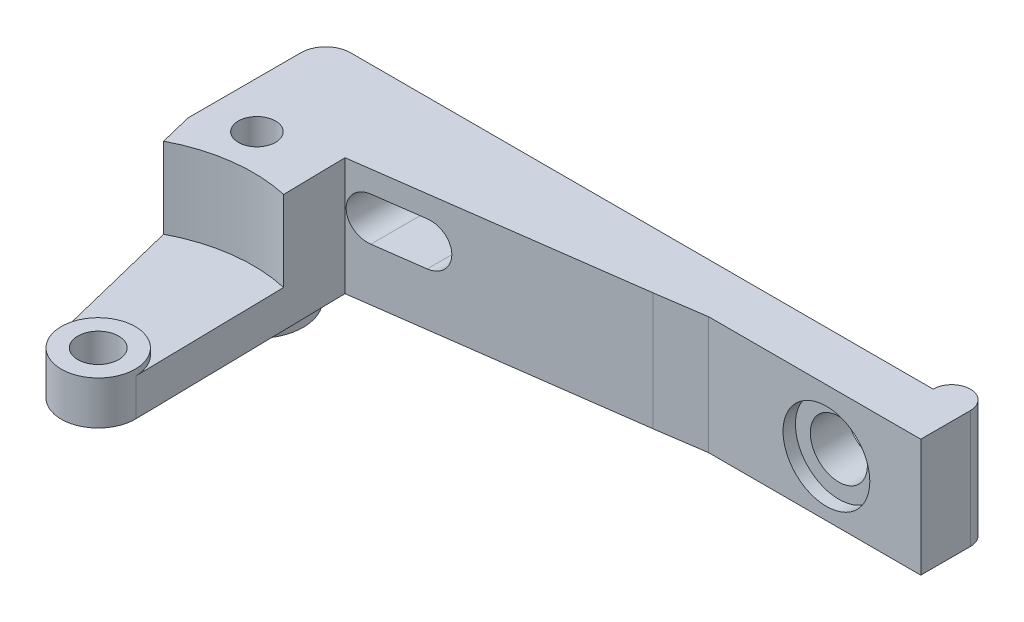
ISO-10303-21;
HEADER;
FILE_DESCRIPTION(('STEP AP214'),'2;1');
FILE_NAME('part.step','',(''),(''),'','','');
FILE_SCHEMA(('AUTOMOTIVE_DESIGN { 1 0 10303 214 1 1 1 1 }'));
ENDSEC;
DATA;
#1=APPLICATION_CONTEXT('core data for automotive mechanical design processes');
#2=APPLICATION_PROTOCOL_DEFINITION('international standard','automotive_design',2000,#1);
#3=PRODUCT_CONTEXT('',#1,'mechanical');
#4=PRODUCT('Part','Part','',(#3));
#5=PRODUCT_RELATED_PRODUCT_CATEGORY('part','',(#4));
#6=PRODUCT_DEFINITION_FORMATION('','',#4);
#7=PRODUCT_DEFINITION_CONTEXT('part definition',#1,'design');
#8=PRODUCT_DEFINITION('design','',#6,#7);
#9=PRODUCT_DEFINITION_SHAPE('','',#8);
#10=(LENGTH_UNIT() NAMED_UNIT(*) SI_UNIT(.MILLI.,.METRE.));
#11=(NAMED_UNIT(*) PLANE_ANGLE_UNIT() SI_UNIT($,.RADIAN.));
#12=(NAMED_UNIT(*) SI_UNIT($,.STERADIAN.) SOLID_ANGLE_UNIT());
#13=UNCERTAINTY_MEASURE_WITH_UNIT(LENGTH_MEASURE(1.E-05),#10,'distance_accuracy_value','');
#14=(GEOMETRIC_REPRESENTATION_CONTEXT(3) GLOBAL_UNCERTAINTY_ASSIGNED_CONTEXT((#13)) GLOBAL_UNIT_ASSIGNED_CONTEXT((#10,
#11,#12)) REPRESENTATION_CONTEXT('',''));
#15=CARTESIAN_POINT('',(0.,0.,0.));
#16=DIRECTION('',(0.,0.,1.));
#17=DIRECTION('',(1.,0.,0.));
#18=AXIS2_PLACEMENT_3D('',#15,#16,#17);
#19=CARTESIAN_POINT('',(-19.311762734,-1.3,-11.738537216));
#20=DIRECTION('',(0.,-1.,0.));
#21=DIRECTION('',(0.00664166681146744,0.,-0.999977943887747));
#22=AXIS2_PLACEMENT_3D('',#19,#20,#21);
#23=PLANE('',#22);
#24=CARTESIAN_POINT('',(-15.5,-1.3,-15.5));
#25=DIRECTION('',(0.,-1.,0.));
#26=DIRECTION('',(0.,0.,-1.));
#27=AXIS2_PLACEMENT_3D('',#24,#25,#26);
#28=CIRCLE('',#27,3.15);
#29=CARTESIAN_POINT('',(-15.5,-1.3,-18.65));
#30=VERTEX_POINT('',#29);
#31=EDGE_CURVE('E21',#30,#30,#28,.T.);
#32=ORIENTED_EDGE('',*,*,#31,.F.);
#33=EDGE_LOOP('',(#32));
#34=FACE_BOUND('',#33,.T.);
#35=CARTESIAN_POINT('',(-15.5,-1.3,-15.5));
#36=DIRECTION('',(0.,1.,0.));
#37=DIRECTION('',(0.,0.,1.));
#38=AXIS2_PLACEMENT_3D('',#35,#36,#37);
#39=CIRCLE('',#38,3.741794742);
#40=CARTESIAN_POINT('',(-15.5,-1.3,-11.758205258));
#41=VERTEX_POINT('',#40);
#42=EDGE_CURVE('E146',#41,#41,#39,.F.);
#43=ORIENTED_EDGE('',*,*,#42,.T.);
#44=EDGE_LOOP('',(#43));
#45=FACE_BOUND('',#44,.T.);
#46=ADVANCED_FACE('F17',(#34,#45),#23,.T.);
#47=CARTESIAN_POINT('',(-15.816574251,4.5,-3.016574251));
#48=DIRECTION('',(0.,1.,0.));
#49=DIRECTION('',(0.,0.,1.));
#50=AXIS2_PLACEMENT_3D('',#47,#48,#49);
#51=PLANE('',#50);
#52=CARTESIAN_POINT('',(-12.8,4.5,0.));
#53=DIRECTION('',(0.,1.,0.));
#54=DIRECTION('',(0.,0.,1.));
#55=AXIS2_PLACEMENT_3D('',#52,#53,#54);
#56=CIRCLE('',#55,1.65);
#57=CARTESIAN_POINT('',(-12.8,4.5,1.65));
#58=VERTEX_POINT('',#57);
#59=EDGE_CURVE('E247',#58,#58,#56,.T.);
#60=ORIENTED_EDGE('',*,*,#59,.F.);
#61=EDGE_LOOP('',(#60));
#62=FACE_BOUND('',#61,.T.);
#63=CARTESIAN_POINT('',(-12.8,4.5,0.));
#64=DIRECTION('',(0.,1.,0.));
#65=DIRECTION('',(0.,0.,1.));
#66=AXIS2_PLACEMENT_3D('',#63,#64,#65);
#67=CIRCLE('',#66,2.980804595);
#68=CARTESIAN_POINT('',(-12.8,4.5,2.980804595));
#69=VERTEX_POINT('',#68);
#70=EDGE_CURVE('E147',#69,#69,#67,.T.);
#71=ORIENTED_EDGE('',*,*,#70,.T.);
#72=EDGE_LOOP('',(#71));
#73=FACE_BOUND('',#72,.T.);
#74=ADVANCED_FACE('F262',(#62,#73),#51,.T.);
#75=CARTESIAN_POINT('',(-15.5,0.35,-15.5));
#76=DIRECTION('',(0.,-1.,0.));
#77=DIRECTION('',(0.,0.,-1.));
#78=AXIS2_PLACEMENT_3D('',#75,#76,#77);
#79=CONICAL_SURFACE('',#78,1.5,0.785398163397449);
#80=ORIENTED_EDGE('',*,*,#31,.T.);
#81=EDGE_LOOP('',(#80));
#82=FACE_BOUND('',#81,.T.);
#83=CARTESIAN_POINT('',(-15.5,0.35,-15.5));
#84=DIRECTION('',(0.,1.,0.));
#85=DIRECTION('',(0.,0.,1.));
#86=AXIS2_PLACEMENT_3D('',#83,#84,#85);
#87=CIRCLE('',#86,1.5);
#88=CARTESIAN_POINT('',(-15.5,0.35,-14.));
#89=VERTEX_POINT('',#88);
#90=EDGE_CURVE('E167',#89,#89,#87,.F.);
#91=ORIENTED_EDGE('',*,*,#90,.F.);
#92=EDGE_LOOP('',(#91));
#93=FACE_BOUND('',#92,.T.);
#94=ADVANCED_FACE('F257',(#82,#93),#79,.F.);
#95=CARTESIAN_POINT('',(25.15,5.5,-21.79));
#96=DIRECTION('',(0.,0.,1.));
#97=DIRECTION('',(1.,0.,0.));
#98=AXIS2_PLACEMENT_3D('',#95,#96,#97);
#99=CYLINDRICAL_SURFACE('',#98,3.5);
#100=CARTESIAN_POINT('',(25.15,5.5,-20.792378842));
#101=DIRECTION('',(0.,0.,1.));
#102=DIRECTION('',(1.,0.,0.));
#103=AXIS2_PLACEMENT_3D('',#100,#101,#102);
#104=CIRCLE('',#103,3.5);
#105=CARTESIAN_POINT('',(28.65,5.5,-20.792378842));
#106=VERTEX_POINT('',#105);
#107=EDGE_CURVE('E244',#106,#106,#104,.F.);
#108=ORIENTED_EDGE('',*,*,#107,.F.);
#109=EDGE_LOOP('',(#108));
#110=FACE_BOUND('',#109,.T.);
#111=CARTESIAN_POINT('',(25.15,5.5,-21.79));
#112=DIRECTION('',(0.,0.,1.));
#113=DIRECTION('',(1.,0.,0.));
#114=AXIS2_PLACEMENT_3D('',#111,#112,#113);
#115=CIRCLE('',#114,3.5);
#116=CARTESIAN_POINT('',(28.65,5.5,-21.79));
#117=VERTEX_POINT('',#116);
#118=EDGE_CURVE('E239',#117,#117,#115,.T.);
#119=ORIENTED_EDGE('',*,*,#118,.F.);
#120=EDGE_LOOP('',(#119));
#121=FACE_BOUND('',#120,.T.);
#122=ADVANCED_FACE('F385',(#110,#121),#99,.F.);
#123=CARTESIAN_POINT('',(-18.653115947,4.,-12.57915984));
#124=DIRECTION('',(0.,1.,0.));
#125=DIRECTION('',(0.,0.,1.));
#126=AXIS2_PLACEMENT_3D('',#123,#124,#125);
#127=PLANE('',#126);
#128=DIRECTION('',(-0.0179505484340694,0.,-0.999838875924974));
#129=VECTOR('',#128,1.);
#130=CARTESIAN_POINT('',(-9.9739161905,4.000000003,-8.644645961));
#131=LINE('',#130,#129);
#132=CARTESIAN_POINT('',(-9.81967568400235,4.00000000125,-0.0535070771309196));
#133=VERTEX_POINT('',#132);
#134=CARTESIAN_POINT('',(-10.0376044416016,4.0000000015,-12.1920578757365));
#135=VERTEX_POINT('',#134);
#136=EDGE_CURVE('E291',#133,#135,#131,.T.);
#137=ORIENTED_EDGE('',*,*,#136,.T.);
#138=CARTESIAN_POINT('',(-12.8,4.,0.));
#139=DIRECTION('',(0.,1.,0.));
#140=DIRECTION('',(0.,0.,1.));
#141=AXIS2_PLACEMENT_3D('',#138,#139,#140);
#142=CIRCLE('',#141,12.50108413);
#143=CARTESIAN_POINT('',(-18.6004314143658,4.,-11.0739378647605));
#144=VERTEX_POINT('',#143);
#145=EDGE_CURVE('E156',#144,#135,#142,.F.);
#146=ORIENTED_EDGE('',*,*,#145,.F.);
#147=DIRECTION('',(0.239970033252848,0.,0.970780296019973));
#148=VECTOR('',#147,1.);
#149=CARTESIAN_POINT('',(-17.489189654,4.000000003,-6.5784948775));
#150=LINE('',#149,#148);
#151=CARTESIAN_POINT('',(-15.736584565759,4.00000000125,0.511534086975136));
#152=VERTEX_POINT('',#151);
#153=EDGE_CURVE('E152',#144,#152,#150,.T.);
#154=ORIENTED_EDGE('',*,*,#153,.T.);
#155=CARTESIAN_POINT('',(-12.8,3.9999999995,0.));
#156=DIRECTION('',(0.,1.,0.));
#157=DIRECTION('',(0.,0.,1.));
#158=AXIS2_PLACEMENT_3D('',#155,#156,#157);
#159=CIRCLE('',#158,2.980804595);
#160=EDGE_CURVE('E134',#152,#133,#159,.F.);
#161=ORIENTED_EDGE('',*,*,#160,.T.);
#162=EDGE_LOOP('',(#137,#146,#154,#161));
#163=FACE_BOUND('',#162,.T.);
#164=ADVANCED_FACE('F159',(#163),#127,.T.);
#165=CARTESIAN_POINT('',(-12.8,1.,0.));
#166=DIRECTION('',(0.,1.,0.));
#167=DIRECTION('',(0.,0.,1.));
#168=AXIS2_PLACEMENT_3D('',#165,#166,#167);
#169=CYLINDRICAL_SURFACE('',#168,2.980804595);
#170=CARTESIAN_POINT('',(-12.8,1.,0.));
#171=DIRECTION('',(0.,1.,0.));
#172=DIRECTION('',(0.,0.,1.));
#173=AXIS2_PLACEMENT_3D('',#170,#171,#172);
#174=CIRCLE('',#173,2.980804595);
#175=CARTESIAN_POINT('',(-9.81967569093019,1.,-0.0535070762544408));
#176=VERTEX_POINT('',#175);
#177=CARTESIAN_POINT('',(-15.7365845679547,1.,0.511534074369674));
#178=VERTEX_POINT('',#177);
#179=EDGE_CURVE('E231',#176,#178,#174,.F.);
#180=ORIENTED_EDGE('',*,*,#179,.F.);
#181=DIRECTION('',(0.,1.,0.));
#182=VECTOR('',#181,1.);
#183=CARTESIAN_POINT('',(-9.819675684,5.75,-0.053507077));
#184=LINE('',#183,#182);
#185=EDGE_CURVE('E141',#176,#133,#184,.T.);
#186=ORIENTED_EDGE('',*,*,#185,.T.);
#187=ORIENTED_EDGE('',*,*,#160,.F.);
#188=DIRECTION('',(0.,-1.,0.));
#189=VECTOR('',#188,1.);
#190=CARTESIAN_POINT('',(-15.736584566,5.75,0.511534086));
#191=LINE('',#190,#189);
#192=EDGE_CURVE('E138',#152,#178,#191,.T.);
#193=ORIENTED_EDGE('',*,*,#192,.T.);
#194=EDGE_LOOP('',(#180,#186,#187,#193));
#195=FACE_BOUND('',#194,.T.);
#196=ORIENTED_EDGE('',*,*,#70,.F.);
#197=EDGE_LOOP('',(#196));
#198=FACE_BOUND('',#197,.T.);
#199=ADVANCED_FACE('F136',(#195,#198),#169,.T.);
#200=CARTESIAN_POINT('',(-15.5,-1.3,-15.5));
#201=DIRECTION('',(0.,1.,0.));
#202=DIRECTION('',(0.,0.,1.));
#203=AXIS2_PLACEMENT_3D('',#200,#201,#202);
#204=CYLINDRICAL_SURFACE('',#203,3.741794742);
#205=ORIENTED_EDGE('',*,*,#42,.F.);
#206=EDGE_LOOP('',(#205));
#207=FACE_BOUND('',#206,.T.);
#208=CARTESIAN_POINT('',(-15.5,0.999999999999999,-15.5));
#209=DIRECTION('',(0.,1.,0.));
#210=DIRECTION('',(0.,0.,1.));
#211=AXIS2_PLACEMENT_3D('',#208,#209,#210);
#212=CIRCLE('',#211,3.741794742);
#213=CARTESIAN_POINT('',(-19.241794742,1.,-15.4999999989361));
#214=VERTEX_POINT('',#213);
#215=EDGE_CURVE('E226',#214,#214,#212,.T.);
#216=ORIENTED_EDGE('',*,*,#215,.F.);
#217=EDGE_LOOP('',(#216));
#218=FACE_BOUND('',#217,.T.);
#219=ADVANCED_FACE('F266',(#207,#218),#204,.T.);
#220=CARTESIAN_POINT('',(-12.8,1.,0.));
#221=DIRECTION('',(0.,1.,0.));
#222=DIRECTION('',(0.,0.,1.));
#223=AXIS2_PLACEMENT_3D('',#220,#221,#222);
#224=CYLINDRICAL_SURFACE('',#223,1.65);
#225=CARTESIAN_POINT('',(-12.8,1.,0.));
#226=DIRECTION('',(0.,1.,0.));
#227=DIRECTION('',(0.,0.,1.));
#228=AXIS2_PLACEMENT_3D('',#225,#226,#227);
#229=CIRCLE('',#228,1.65);
#230=CARTESIAN_POINT('',(-12.8,1.,1.65));
#231=VERTEX_POINT('',#230);
#232=EDGE_CURVE('E220',#231,#231,#229,.T.);
#233=ORIENTED_EDGE('',*,*,#232,.F.);
#234=EDGE_LOOP('',(#233));
#235=FACE_BOUND('',#234,.T.);
#236=ORIENTED_EDGE('',*,*,#59,.T.);
#237=EDGE_LOOP('',(#236));
#238=FACE_BOUND('',#237,.T.);
#239=ADVANCED_FACE('F269',(#235,#238),#224,.F.);
#240=CARTESIAN_POINT('',(15.645149674,1.,-20.792378842));
#241=DIRECTION('',(0.,0.,1.));
#242=DIRECTION('',(1.,0.,0.));
#243=AXIS2_PLACEMENT_3D('',#240,#241,#242);
#244=PLANE('',#243);
#245=ORIENTED_EDGE('',*,*,#107,.T.);
#246=EDGE_LOOP('',(#245));
#247=FACE_BOUND('',#246,.T.);
#248=DIRECTION('',(1.,0.,0.));
#249=VECTOR('',#248,1.);
#250=CARTESIAN_POINT('',(6.758205258,10.5,-20.7923788489076));
#251=LINE('',#250,#249);
#252=CARTESIAN_POINT('',(15.645149668,10.5,-20.7923788471807));
#253=VERTEX_POINT('',#252);
#254=CARTESIAN_POINT('',(32.758205258,10.5,-20.7923788466051));
#255=VERTEX_POINT('',#254);
#256=EDGE_CURVE('E302',#253,#255,#251,.T.);
#257=ORIENTED_EDGE('',*,*,#256,.F.);
#258=DIRECTION('',(0.,1.,0.));
#259=VECTOR('',#258,1.);
#260=CARTESIAN_POINT('',(15.645149674,5.75,-20.792378842));
#261=LINE('',#260,#259);
#262=CARTESIAN_POINT('',(15.645149668,1.,-20.7923788435432));
#263=VERTEX_POINT('',#262);
#264=EDGE_CURVE('E290',#263,#253,#261,.T.);
#265=ORIENTED_EDGE('',*,*,#264,.F.);
#266=DIRECTION('',(-1.,0.,0.));
#267=VECTOR('',#266,1.);
#268=CARTESIAN_POINT('',(6.758205258,1.,-20.7923788440576));
#269=LINE('',#268,#267);
#270=CARTESIAN_POINT('',(32.758205258,1.,-20.7923788433717));
#271=VERTEX_POINT('',#270);
#272=EDGE_CURVE('E238',#271,#263,#269,.T.);
#273=ORIENTED_EDGE('',*,*,#272,.F.);
#274=DIRECTION('',(0.,-1.,0.));
#275=VECTOR('',#274,1.);
#276=CARTESIAN_POINT('',(32.758205258,5.75,-20.792378842));
#277=LINE('',#276,#275);
#278=EDGE_CURVE('E163',#255,#271,#277,.T.);
#279=ORIENTED_EDGE('',*,*,#278,.F.);
#280=EDGE_LOOP('',(#257,#265,#273,#279));
#281=FACE_BOUND('',#280,.T.);
#282=ADVANCED_FACE('F342',(#247,#281),#244,.T.);
#283=CARTESIAN_POINT('',(32.758205258,1.,-20.792378842));
#284=DIRECTION('',(1.,0.,0.));
#285=DIRECTION('',(0.,0.,-1.));
#286=AXIS2_PLACEMENT_3D('',#283,#284,#285);
#287=PLANE('',#286);
#288=DIRECTION('',(0.,0.,1.));
#289=VECTOR('',#288,1.);
#290=CARTESIAN_POINT('',(32.758205258,1.,-11.6557871235));
#291=LINE('',#290,#289);
#292=CARTESIAN_POINT('',(32.758205258,1.,-24.7923788421538));
#293=VERTEX_POINT('',#292);
#294=EDGE_CURVE('E281',#293,#271,#291,.T.);
#295=ORIENTED_EDGE('',*,*,#294,.F.);
#296=DIRECTION('',(0.,-1.,0.));
#297=VECTOR('',#296,1.);
#298=CARTESIAN_POINT('',(32.758205258,5.75,-24.7923788423077));
#299=LINE('',#298,#297);
#300=CARTESIAN_POINT('',(32.758205258,10.5,-24.7923788421538));
#301=VERTEX_POINT('',#300);
#302=EDGE_CURVE('E219',#293,#301,#299,.F.);
#303=ORIENTED_EDGE('',*,*,#302,.T.);
#304=DIRECTION('',(0.,0.,-1.));
#305=VECTOR('',#304,1.);
#306=CARTESIAN_POINT('',(32.758205258,10.5,-18.683158354));
#307=LINE('',#306,#305);
#308=EDGE_CURVE('E215',#255,#301,#307,.T.);
#309=ORIENTED_EDGE('',*,*,#308,.F.);
#310=ORIENTED_EDGE('',*,*,#278,.T.);
#311=EDGE_LOOP('',(#295,#303,#309,#310));
#312=FACE_BOUND('',#311,.T.);
#313=ADVANCED_FACE('F334',(#312),#287,.T.);
#314=CARTESIAN_POINT('',(-19.241794742,1.,-13.668523841));
#315=DIRECTION('',(1.,0.,0.));
#316=DIRECTION('',(0.,0.,-1.));
#317=AXIS2_PLACEMENT_3D('',#314,#315,#316);
#318=PLANE('',#317);
#319=DIRECTION('',(0.,1.,0.));
#320=VECTOR('',#319,1.);
#321=CARTESIAN_POINT('',(-19.241794742,5.75,-13.668523841));
#322=LINE('',#321,#320);
#323=CARTESIAN_POINT('',(-19.241794742,1.,-13.6685238471027));
#324=VERTEX_POINT('',#323);
#325=CARTESIAN_POINT('',(-19.241794742,10.5,-13.6685238419923));
#326=VERTEX_POINT('',#325);
#327=EDGE_CURVE('E160',#324,#326,#322,.T.);
#328=ORIENTED_EDGE('',*,*,#327,.T.);
#329=DIRECTION('',(0.,0.,1.));
#330=VECTOR('',#329,1.);
#331=CARTESIAN_POINT('',(-19.241794742,10.5,-18.683158354));
#332=LINE('',#331,#330);
#333=CARTESIAN_POINT('',(-19.241794742,10.5,-22.7923788423847));
#334=VERTEX_POINT('',#333);
#335=EDGE_CURVE('E209',#334,#326,#332,.T.);
#336=ORIENTED_EDGE('',*,*,#335,.F.);
#337=DIRECTION('',(0.,1.,0.));
#338=VECTOR('',#337,1.);
#339=CARTESIAN_POINT('',(-19.241794742,5.75,-22.7923788427694));
#340=LINE('',#339,#338);
#341=CARTESIAN_POINT('',(-19.241794742,1.,-22.7923788423847));
#342=VERTEX_POINT('',#341);
#343=EDGE_CURVE('E284',#334,#342,#340,.F.);
#344=ORIENTED_EDGE('',*,*,#343,.T.);
#345=DIRECTION('',(0.,0.,-1.));
#346=VECTOR('',#345,1.);
#347=CARTESIAN_POINT('',(-19.241794742,1.,-11.6557871235));
#348=LINE('',#347,#346);
#349=EDGE_CURVE('E225',#214,#342,#348,.T.);
#350=ORIENTED_EDGE('',*,*,#349,.F.);
#351=DIRECTION('',(0.,0.,-1.));
#352=VECTOR('',#351,1.);
#353=CARTESIAN_POINT('',(-19.241794742,1.,-11.6557871235));
#354=LINE('',#353,#352);
#355=EDGE_CURVE('E229',#324,#214,#354,.T.);
#356=ORIENTED_EDGE('',*,*,#355,.F.);
#357=EDGE_LOOP('',(#328,#336,#344,#350,#356));
#358=FACE_BOUND('',#357,.T.);
#359=ADVANCED_FACE('F332',(#358),#318,.F.);
#360=CARTESIAN_POINT('',(-15.736584566,1.,0.511534086));
#361=DIRECTION('',(0.970780296019973,0.,-0.239970033252848));
#362=DIRECTION('',(-0.239970033252848,0.,-0.970780296019973));
#363=AXIS2_PLACEMENT_3D('',#360,#361,#362);
#364=PLANE('',#363);
#365=ORIENTED_EDGE('',*,*,#192,.F.);
#366=ORIENTED_EDGE('',*,*,#153,.F.);
#367=DIRECTION('',(0.,1.,0.));
#368=VECTOR('',#367,1.);
#369=CARTESIAN_POINT('',(-18.6004314161337,7.25,-11.0739378638345));
#370=LINE('',#369,#368);
#371=CARTESIAN_POINT('',(-18.6004314180962,10.5,-11.0739378628065));
#372=VERTEX_POINT('',#371);
#373=EDGE_CURVE('E243',#372,#144,#370,.F.);
#374=ORIENTED_EDGE('',*,*,#373,.F.);
#375=DIRECTION('',(0.239970030108472,0.,0.970780296797241));
#376=VECTOR('',#375,1.);
#377=CARTESIAN_POINT('',(-19.241794742,10.5,-13.6685238429846));
#378=LINE('',#377,#376);
#379=EDGE_CURVE('E207',#326,#372,#378,.T.);
#380=ORIENTED_EDGE('',*,*,#379,.F.);
#381=ORIENTED_EDGE('',*,*,#327,.F.);
#382=DIRECTION('',(-0.239970033176929,0.,-0.97078029603874));
#383=VECTOR('',#382,1.);
#384=CARTESIAN_POINT('',(-15.736584566,1.,0.511534078554874));
#385=LINE('',#384,#383);
#386=EDGE_CURVE('E155',#178,#324,#385,.T.);
#387=ORIENTED_EDGE('',*,*,#386,.F.);
#388=EDGE_LOOP('',(#365,#366,#374,#380,#381,#387));
#389=FACE_BOUND('',#388,.T.);
#390=ADVANCED_FACE('F150',(#389),#364,.F.);
#391=CARTESIAN_POINT('',(-12.8,4.,0.));
#392=DIRECTION('',(0.,1.,0.));
#393=DIRECTION('',(0.,0.,1.));
#394=AXIS2_PLACEMENT_3D('',#391,#392,#393);
#395=CYLINDRICAL_SURFACE('',#394,12.50108413);
#396=CARTESIAN_POINT('',(-12.8,10.5,0.));
#397=DIRECTION('',(0.,1.,0.));
#398=DIRECTION('',(0.,0.,1.));
#399=AXIS2_PLACEMENT_3D('',#396,#397,#398);
#400=CIRCLE('',#399,12.50108413);
#401=CARTESIAN_POINT('',(-10.0376044318099,10.5,-12.192057873518));
#402=VERTEX_POINT('',#401);
#403=EDGE_CURVE('E205',#372,#402,#400,.F.);
#404=ORIENTED_EDGE('',*,*,#403,.F.);
#405=ORIENTED_EDGE('',*,*,#373,.T.);
#406=ORIENTED_EDGE('',*,*,#145,.T.);
#407=DIRECTION('',(0.,1.,0.));
#408=VECTOR('',#407,1.);
#409=CARTESIAN_POINT('',(-10.037604441632,5.75,-12.192057877426));
#410=LINE('',#409,#408);
#411=EDGE_CURVE('E287',#135,#402,#410,.T.);
#412=ORIENTED_EDGE('',*,*,#411,.T.);
#413=EDGE_LOOP('',(#404,#405,#406,#412));
#414=FACE_BOUND('',#413,.T.);
#415=ADVANCED_FACE('F324',(#414),#395,.F.);
#416=CARTESIAN_POINT('',(-15.5,0.35,-15.5));
#417=DIRECTION('',(0.,1.,0.));
#418=DIRECTION('',(0.,0.,1.));
#419=AXIS2_PLACEMENT_3D('',#416,#417,#418);
#420=CYLINDRICAL_SURFACE('',#419,1.5);
#421=CARTESIAN_POINT('',(-15.5,10.5,-15.5));
#422=DIRECTION('',(0.,1.,0.));
#423=DIRECTION('',(0.,0.,1.));
#424=AXIS2_PLACEMENT_3D('',#421,#422,#423);
#425=CIRCLE('',#424,1.5);
#426=CARTESIAN_POINT('',(-15.5,10.5,-14.));
#427=VERTEX_POINT('',#426);
#428=EDGE_CURVE('E197',#427,#427,#425,.F.);
#429=ORIENTED_EDGE('',*,*,#428,.F.);
#430=EDGE_LOOP('',(#429));
#431=FACE_BOUND('',#430,.T.);
#432=ORIENTED_EDGE('',*,*,#90,.T.);
#433=EDGE_LOOP('',(#432));
#434=FACE_BOUND('',#433,.T.);
#435=ADVANCED_FACE('F373',(#431,#434),#420,.F.);
#436=CARTESIAN_POINT('',(21.608,1.958,-21.79));
#437=DIRECTION('',(0.,0.,1.));
#438=DIRECTION('',(1.,0.,0.));
#439=AXIS2_PLACEMENT_3D('',#436,#437,#438);
#440=PLANE('',#439);
#441=CARTESIAN_POINT('',(25.15,5.5,-21.79));
#442=DIRECTION('',(0.,0.,-1.));
#443=DIRECTION('',(-1.,0.,0.));
#444=AXIS2_PLACEMENT_3D('',#441,#442,#443);
#445=CIRCLE('',#444,2.3);
#446=CARTESIAN_POINT('',(22.85,5.5,-21.79));
#447=VERTEX_POINT('',#446);
#448=EDGE_CURVE('E193',#447,#447,#445,.F.);
#449=ORIENTED_EDGE('',*,*,#448,.F.);
#450=EDGE_LOOP('',(#449));
#451=FACE_BOUND('',#450,.T.);
#452=ORIENTED_EDGE('',*,*,#118,.T.);
#453=EDGE_LOOP('',(#452));
#454=FACE_BOUND('',#453,.T.);
#455=ADVANCED_FACE('F376',(#451,#454),#440,.T.);
#456=CARTESIAN_POINT('',(-10.128156697,1.,-17.235784845));
#457=DIRECTION('',(-0.999838875924974,0.,0.0179505484340694));
#458=DIRECTION('',(0.0179505484340694,0.,0.999838875924974));
#459=AXIS2_PLACEMENT_3D('',#456,#457,#458);
#460=PLANE('',#459);
#461=DIRECTION('',(0.,1.,0.));
#462=VECTOR('',#461,1.);
#463=CARTESIAN_POINT('',(-10.128156697,5.75,-17.235784845));
#464=LINE('',#463,#462);
#465=CARTESIAN_POINT('',(-10.1281566996012,1.,-17.2357848446449));
#466=VERTEX_POINT('',#465);
#467=CARTESIAN_POINT('',(-10.1281566994552,10.5,-17.2357848446648));
#468=VERTEX_POINT('',#467);
#469=EDGE_CURVE('E294',#466,#468,#464,.T.);
#470=ORIENTED_EDGE('',*,*,#469,.T.);
#471=DIRECTION('',(-0.0179505532746302,0.,-0.99983887583807));
#472=VECTOR('',#471,1.);
#473=CARTESIAN_POINT('',(-10.037604422,10.5,-12.1920578702873));
#474=LINE('',#473,#472);
#475=EDGE_CURVE('E203',#402,#468,#474,.T.);
#476=ORIENTED_EDGE('',*,*,#475,.F.);
#477=ORIENTED_EDGE('',*,*,#411,.F.);
#478=ORIENTED_EDGE('',*,*,#136,.F.);
#479=ORIENTED_EDGE('',*,*,#185,.F.);
#480=DIRECTION('',(0.017950547929603,0.,0.999838875934031));
#481=VECTOR('',#480,1.);
#482=CARTESIAN_POINT('',(-10.128156702,1.,-17.2357848330194));
#483=LINE('',#482,#481);
#484=EDGE_CURVE('E233',#466,#176,#483,.T.);
#485=ORIENTED_EDGE('',*,*,#484,.F.);
#486=EDGE_LOOP('',(#470,#476,#477,#478,#479,#485));
#487=FACE_BOUND('',#486,.T.);
#488=ADVANCED_FACE('F319',(#487),#460,.F.);
#489=CARTESIAN_POINT('',(11.724005161,1.,-20.219161249));
#490=DIRECTION('',(0.144648862207924,0.,0.989483050214582));
#491=DIRECTION('',(0.989483050214582,0.,-0.144648862207924));
#492=AXIS2_PLACEMENT_3D('',#489,#490,#491);
#493=PLANE('',#492);
#494=ORIENTED_EDGE('',*,*,#264,.T.);
#495=DIRECTION('',(0.989483049751185,0.,-0.144648865377832));
#496=VECTOR('',#495,1.);
#497=CARTESIAN_POINT('',(11.724005162,10.5,-20.2191612449778));
#498=LINE('',#497,#496);
#499=CARTESIAN_POINT('',(11.7240053767321,10.5,-20.2191612784529));
#500=VERTEX_POINT('',#499);
#501=EDGE_CURVE('E200',#500,#253,#498,.T.);
#502=ORIENTED_EDGE('',*,*,#501,.F.);
#503=DIRECTION('',(0.,-1.,0.));
#504=VECTOR('',#503,1.);
#505=CARTESIAN_POINT('',(11.724005161,5.75,-20.219161249));
#506=LINE('',#505,#504);
#507=CARTESIAN_POINT('',(11.7240055343826,1.,-20.2191612999763));
#508=VERTEX_POINT('',#507);
#509=EDGE_CURVE('E169',#500,#508,#506,.T.);
#510=ORIENTED_EDGE('',*,*,#509,.T.);
#511=DIRECTION('',(-0.989483049816351,0.,0.144648864932055));
#512=VECTOR('',#511,1.);
#513=CARTESIAN_POINT('',(15.645149662,1.,-20.7923788440576));
#514=LINE('',#513,#512);
#515=EDGE_CURVE('E236',#263,#508,#514,.T.);
#516=ORIENTED_EDGE('',*,*,#515,.F.);
#517=EDGE_LOOP('',(#494,#502,#510,#516));
#518=FACE_BOUND('',#517,.T.);
#519=ADVANCED_FACE('F371',(#518),#493,.T.);
#520=CARTESIAN_POINT('',(-17.241794742,1.,-22.792378842));
#521=DIRECTION('',(0.,1.,0.));
#522=DIRECTION('',(0.,0.,1.));
#523=AXIS2_PLACEMENT_3D('',#520,#521,#522);
#524=CYLINDRICAL_SURFACE('',#523,2.);
#525=CARTESIAN_POINT('',(-17.241794742,1.,-22.792378842));
#526=DIRECTION('',(0.,1.,0.));
#527=DIRECTION('',(0.,0.,1.));
#528=AXIS2_PLACEMENT_3D('',#525,#526,#527);
#529=CIRCLE('',#528,2.);
#530=CARTESIAN_POINT('',(-17.241794742,1.,-24.792378842));
#531=VERTEX_POINT('',#530);
#532=EDGE_CURVE('E223',#342,#531,#529,.F.);
#533=ORIENTED_EDGE('',*,*,#532,.F.);
#534=ORIENTED_EDGE('',*,*,#343,.F.);
#535=CARTESIAN_POINT('',(-17.241794742,10.5,-22.792378842));
#536=DIRECTION('',(0.,1.,0.));
#537=DIRECTION('',(0.,0.,1.));
#538=AXIS2_PLACEMENT_3D('',#535,#536,#537);
#539=CIRCLE('',#538,2.);
#540=CARTESIAN_POINT('',(-17.241794742,10.5,-24.792378842));
#541=VERTEX_POINT('',#540);
#542=EDGE_CURVE('E210',#541,#334,#539,.T.);
#543=ORIENTED_EDGE('',*,*,#542,.F.);
#544=DIRECTION('',(0.,-1.,0.));
#545=VECTOR('',#544,1.);
#546=CARTESIAN_POINT('',(-17.241794742,5.75,-24.792378842));
#547=LINE('',#546,#545);
#548=EDGE_CURVE('E425',#541,#531,#547,.T.);
#549=ORIENTED_EDGE('',*,*,#548,.T.);
#550=EDGE_LOOP('',(#533,#534,#543,#549));
#551=FACE_BOUND('',#550,.T.);
#552=ADVANCED_FACE('F368',(#551),#524,.T.);
#553=CARTESIAN_POINT('',(-19.241794742,1.,3.156443696));
#554=DIRECTION('',(0.,-1.,0.));
#555=DIRECTION('',(0.,0.,-1.));
#556=AXIS2_PLACEMENT_3D('',#553,#554,#555);
#557=PLANE('',#556);
#558=ORIENTED_EDGE('',*,*,#232,.T.);
#559=EDGE_LOOP('',(#558));
#560=FACE_BOUND('',#559,.T.);
#561=ORIENTED_EDGE('',*,*,#349,.T.);
#562=ORIENTED_EDGE('',*,*,#532,.T.);
#563=DIRECTION('',(1.,0.,0.));
#564=VECTOR('',#563,1.);
#565=CARTESIAN_POINT('',(6.258205258,1.,-24.792378842));
#566=LINE('',#565,#564);
#567=CARTESIAN_POINT('',(29.758205258,1.,-24.792378842));
#568=VERTEX_POINT('',#567);
#569=EDGE_CURVE('E423',#531,#568,#566,.T.);
#570=ORIENTED_EDGE('',*,*,#569,.T.);
#571=CARTESIAN_POINT('',(31.258205258,1.,-24.792378842));
#572=DIRECTION('',(0.,1.,0.));
#573=DIRECTION('',(0.,0.,1.));
#574=AXIS2_PLACEMENT_3D('',#571,#572,#573);
#575=CIRCLE('',#574,1.5);
#576=EDGE_CURVE('E216',#568,#293,#575,.F.);
#577=ORIENTED_EDGE('',*,*,#576,.T.);
#578=ORIENTED_EDGE('',*,*,#294,.T.);
#579=ORIENTED_EDGE('',*,*,#272,.T.);
#580=ORIENTED_EDGE('',*,*,#515,.T.);
#581=DIRECTION('',(-0.990808690922721,0.,0.135270610230027));
#582=VECTOR('',#581,1.);
#583=CARTESIAN_POINT('',(0.797924231999998,1.,-18.727473047));
#584=LINE('',#583,#582);
#585=EDGE_CURVE('E172',#508,#466,#584,.T.);
#586=ORIENTED_EDGE('',*,*,#585,.T.);
#587=ORIENTED_EDGE('',*,*,#484,.T.);
#588=ORIENTED_EDGE('',*,*,#179,.T.);
#589=ORIENTED_EDGE('',*,*,#386,.T.);
#590=ORIENTED_EDGE('',*,*,#355,.T.);
#591=ORIENTED_EDGE('',*,*,#215,.T.);
#592=EDGE_LOOP('',(#561,#562,#570,#577,#578,#579,#580,#586,#587,#588,#589,#590,#591));
#593=FACE_BOUND('',#592,.T.);
#594=ADVANCED_FACE('F275',(#560,#593),#557,.T.);
#595=CARTESIAN_POINT('',(31.258205258,1.,-24.792378842));
#596=DIRECTION('',(0.,1.,0.));
#597=DIRECTION('',(0.,0.,1.));
#598=AXIS2_PLACEMENT_3D('',#595,#596,#597);
#599=CYLINDRICAL_SURFACE('',#598,1.5);
#600=ORIENTED_EDGE('',*,*,#576,.F.);
#601=DIRECTION('',(0.,1.,0.));
#602=VECTOR('',#601,1.);
#603=CARTESIAN_POINT('',(29.758205258,5.75,-24.792378842));
#604=LINE('',#603,#602);
#605=CARTESIAN_POINT('',(29.758205258,10.5,-24.792378842));
#606=VERTEX_POINT('',#605);
#607=EDGE_CURVE('E420',#568,#606,#604,.T.);
#608=ORIENTED_EDGE('',*,*,#607,.T.);
#609=CARTESIAN_POINT('',(31.258205258,10.5,-24.792378842));
#610=DIRECTION('',(0.,1.,0.));
#611=DIRECTION('',(0.,0.,1.));
#612=AXIS2_PLACEMENT_3D('',#609,#610,#611);
#613=CIRCLE('',#612,1.5);
#614=EDGE_CURVE('E213',#301,#606,#613,.T.);
#615=ORIENTED_EDGE('',*,*,#614,.F.);
#616=ORIENTED_EDGE('',*,*,#302,.F.);
#617=EDGE_LOOP('',(#600,#608,#615,#616));
#618=FACE_BOUND('',#617,.T.);
#619=ADVANCED_FACE('F364',(#618),#599,.T.);
#620=CARTESIAN_POINT('',(-19.241794742,10.5,-26.383689488));
#621=DIRECTION('',(0.,1.,0.));
#622=DIRECTION('',(0.,0.,1.));
#623=AXIS2_PLACEMENT_3D('',#620,#621,#622);
#624=PLANE('',#623);
#625=ORIENTED_EDGE('',*,*,#428,.T.);
#626=EDGE_LOOP('',(#625));
#627=FACE_BOUND('',#626,.T.);
#628=DIRECTION('',(0.990808690922721,0.,-0.135270610230027));
#629=VECTOR('',#628,1.);
#630=CARTESIAN_POINT('',(0.797924231999998,10.5,-18.727473047));
#631=LINE('',#630,#629);
#632=EDGE_CURVE('E173',#468,#500,#631,.T.);
#633=ORIENTED_EDGE('',*,*,#632,.T.);
#634=ORIENTED_EDGE('',*,*,#501,.T.);
#635=ORIENTED_EDGE('',*,*,#256,.T.);
#636=ORIENTED_EDGE('',*,*,#308,.T.);
#637=ORIENTED_EDGE('',*,*,#614,.T.);
#638=DIRECTION('',(-1.,0.,0.));
#639=VECTOR('',#638,1.);
#640=CARTESIAN_POINT('',(6.258205258,10.5,-24.792378842));
#641=LINE('',#640,#639);
#642=EDGE_CURVE('E189',#606,#541,#641,.T.);
#643=ORIENTED_EDGE('',*,*,#642,.T.);
#644=ORIENTED_EDGE('',*,*,#542,.T.);
#645=ORIENTED_EDGE('',*,*,#335,.T.);
#646=ORIENTED_EDGE('',*,*,#379,.T.);
#647=ORIENTED_EDGE('',*,*,#403,.T.);
#648=ORIENTED_EDGE('',*,*,#475,.T.);
#649=EDGE_LOOP('',(#633,#634,#635,#636,#637,#643,#644,#645,#646,#647,#648));
#650=FACE_BOUND('',#649,.T.);
#651=ADVANCED_FACE('F327',(#627,#650),#624,.T.);
#652=CARTESIAN_POINT('',(25.15,5.5,-21.79));
#653=DIRECTION('',(0.,0.,-1.));
#654=DIRECTION('',(-1.,0.,0.));
#655=AXIS2_PLACEMENT_3D('',#652,#653,#654);
#656=CYLINDRICAL_SURFACE('',#655,2.3);
#657=ORIENTED_EDGE('',*,*,#448,.T.);
#658=EDGE_LOOP('',(#657));
#659=FACE_BOUND('',#658,.T.);
#660=CARTESIAN_POINT('',(25.15,5.5,-24.792378842));
#661=DIRECTION('',(0.,0.,-1.));
#662=DIRECTION('',(-1.,0.,0.));
#663=AXIS2_PLACEMENT_3D('',#660,#661,#662);
#664=CIRCLE('',#663,2.3);
#665=CARTESIAN_POINT('',(22.85,5.5,-24.792378842));
#666=VERTEX_POINT('',#665);
#667=EDGE_CURVE('E186',#666,#666,#664,.T.);
#668=ORIENTED_EDGE('',*,*,#667,.T.);
#669=EDGE_LOOP('',(#668));
#670=FACE_BOUND('',#669,.T.);
#671=ADVANCED_FACE('F360',(#659,#670),#656,.F.);
#672=CARTESIAN_POINT('',(-8.297924273,5.25,-24.792378842));
#673=DIRECTION('',(0.,-1.,0.));
#674=DIRECTION('',(1.,0.,0.));
#675=AXIS2_PLACEMENT_3D('',#672,#673,#674);
#676=PLANE('',#675);
#677=DIRECTION('',(-1.,0.,0.));
#678=VECTOR('',#677,1.);
#679=CARTESIAN_POINT('',(6.258205258,5.2499999995,-24.792378842));
#680=LINE('',#679,#678);
#681=CARTESIAN_POINT('',(-4.2979242726634,5.24999999975,-24.792378842));
#682=VERTEX_POINT('',#681);
#683=CARTESIAN_POINT('',(-8.2979242726634,5.24999999975,-24.792378842));
#684=VERTEX_POINT('',#683);
#685=EDGE_CURVE('E182',#682,#684,#680,.T.);
#686=ORIENTED_EDGE('',*,*,#685,.T.);
#687=DIRECTION('',(0.,0.,1.));
#688=VECTOR('',#687,1.);
#689=CARTESIAN_POINT('',(-8.29792427232679,5.25,-20.996921807));
#690=LINE('',#689,#688);
#691=CARTESIAN_POINT('',(-8.2979242726634,5.249999999875,-17.4856581648154));
#692=VERTEX_POINT('',#691);
#693=EDGE_CURVE('E427',#692,#684,#690,.F.);
#694=ORIENTED_EDGE('',*,*,#693,.F.);
#695=DIRECTION('',(0.990808690922721,0.,-0.135270610230027));
#696=VECTOR('',#695,1.);
#697=CARTESIAN_POINT('',(0.797924231999999,5.2499999995,-18.727473047));
#698=LINE('',#697,#696);
#699=CARTESIAN_POINT('',(-4.2979242726634,5.249999999875,-18.0317599964578));
#700=VERTEX_POINT('',#699);
#701=EDGE_CURVE('E192',#692,#700,#698,.T.);
#702=ORIENTED_EDGE('',*,*,#701,.T.);
#703=DIRECTION('',(0.,0.,-1.));
#704=VECTOR('',#703,1.);
#705=CARTESIAN_POINT('',(-4.29792427232679,5.25,-21.3917875625));
#706=LINE('',#705,#704);
#707=EDGE_CURVE('E196',#682,#700,#706,.F.);
#708=ORIENTED_EDGE('',*,*,#707,.F.);
#709=EDGE_LOOP('',(#686,#694,#702,#708));
#710=FACE_BOUND('',#709,.T.);
#711=ADVANCED_FACE('F358',(#710),#676,.F.);
#712=CARTESIAN_POINT('',(-4.297924273,7.,-17.991196283));
#713=DIRECTION('',(0.,0.,-1.));
#714=DIRECTION('',(-1.,0.,0.));
#715=AXIS2_PLACEMENT_3D('',#712,#713,#714);
#716=CYLINDRICAL_SURFACE('',#715,1.75);
#717=ORIENTED_EDGE('',*,*,#707,.T.);
#718=CARTESIAN_POINT('',(-4.297924273,7.,-18.0317599964118));
#719=DIRECTION('',(-0.135270610230027,0.,-0.990808690922721));
#720=DIRECTION('',(0.990808690922721,0.,-0.135270610230027));
#721=AXIS2_PLACEMENT_3D('',#718,#719,#720);
#722=ELLIPSE('',#721,1.76623400262089,1.75);
#723=CARTESIAN_POINT('',(-4.297924273,8.75,-18.0317599964118));
#724=VERTEX_POINT('',#723);
#725=EDGE_CURVE('E190',#700,#724,#722,.F.);
#726=ORIENTED_EDGE('',*,*,#725,.T.);
#727=DIRECTION('',(0.,0.,-1.));
#728=VECTOR('',#727,1.);
#729=CARTESIAN_POINT('',(-4.297924273,8.75,-21.1170983415));
#730=LINE('',#729,#728);
#731=CARTESIAN_POINT('',(-4.297924273,8.75,-24.792378842));
#732=VERTEX_POINT('',#731);
#733=EDGE_CURVE('E181',#724,#732,#730,.T.);
#734=ORIENTED_EDGE('',*,*,#733,.T.);
#735=CARTESIAN_POINT('',(-4.297924273,7.,-24.792378842));
#736=DIRECTION('',(0.,0.,-1.));
#737=DIRECTION('',(-1.,0.,0.));
#738=AXIS2_PLACEMENT_3D('',#735,#736,#737);
#739=CIRCLE('',#738,1.75);
#740=EDGE_CURVE('E183',#732,#682,#739,.T.);
#741=ORIENTED_EDGE('',*,*,#740,.T.);
#742=EDGE_LOOP('',(#717,#726,#734,#741));
#743=FACE_BOUND('',#742,.T.);
#744=ADVANCED_FACE('F354',(#743),#716,.F.);
#745=CARTESIAN_POINT('',(11.724005161,1.,-20.219161249));
#746=DIRECTION('',(-0.135270610230027,0.,-0.990808690922721));
#747=DIRECTION('',(-0.990808690922721,0.,0.135270610230027));
#748=AXIS2_PLACEMENT_3D('',#745,#746,#747);
#749=PLANE('',#748);
#750=ORIENTED_EDGE('',*,*,#701,.F.);
#751=CARTESIAN_POINT('',(-8.297924273,7.,-17.4856581647694));
#752=DIRECTION('',(-0.135270610230027,0.,-0.990808690922721));
#753=DIRECTION('',(0.990808690922721,0.,-0.135270610230027));
#754=AXIS2_PLACEMENT_3D('',#751,#752,#753);
#755=ELLIPSE('',#754,1.76623400262089,1.75);
#756=CARTESIAN_POINT('',(-8.29792427282054,8.75,-17.4856581647939));
#757=VERTEX_POINT('',#756);
#758=EDGE_CURVE('E175',#757,#692,#755,.F.);
#759=ORIENTED_EDGE('',*,*,#758,.F.);
#760=DIRECTION('',(-0.990808690922721,0.,0.135270610230027));
#761=VECTOR('',#760,1.);
#762=CARTESIAN_POINT('',(11.724005161,8.75,-20.219161249));
#763=LINE('',#762,#761);
#764=EDGE_CURVE('E178',#757,#724,#763,.F.);
#765=ORIENTED_EDGE('',*,*,#764,.T.);
#766=ORIENTED_EDGE('',*,*,#725,.F.);
#767=EDGE_LOOP('',(#750,#759,#765,#766));
#768=FACE_BOUND('',#767,.T.);
#769=ORIENTED_EDGE('',*,*,#509,.F.);
#770=ORIENTED_EDGE('',*,*,#632,.F.);
#771=ORIENTED_EDGE('',*,*,#469,.F.);
#772=ORIENTED_EDGE('',*,*,#585,.F.);
#773=EDGE_LOOP('',(#769,#770,#771,#772));
#774=FACE_BOUND('',#773,.T.);
#775=ADVANCED_FACE('F357',(#768,#774),#749,.F.);
#776=CARTESIAN_POINT('',(-17.241794742,1.,-24.792378842));
#777=DIRECTION('',(0.,0.,1.));
#778=DIRECTION('',(1.,0.,0.));
#779=AXIS2_PLACEMENT_3D('',#776,#777,#778);
#780=PLANE('',#779);
#781=CARTESIAN_POINT('',(-8.297924273,7.00000000000001,-24.792378842));
#782=DIRECTION('',(0.,0.,-1.));
#783=DIRECTION('',(0.,1.,0.));
#784=AXIS2_PLACEMENT_3D('',#781,#782,#783);
#785=CIRCLE('',#784,1.75);
#786=CARTESIAN_POINT('',(-8.29792427282054,8.75,-24.792378842));
#787=VERTEX_POINT('',#786);
#788=EDGE_CURVE('E27',#684,#787,#785,.T.);
#789=ORIENTED_EDGE('',*,*,#788,.F.);
#790=ORIENTED_EDGE('',*,*,#685,.F.);
#791=ORIENTED_EDGE('',*,*,#740,.F.);
#792=DIRECTION('',(-1.,0.,0.));
#793=VECTOR('',#792,1.);
#794=CARTESIAN_POINT('',(-6.297924273,8.75,-24.792378842));
#795=LINE('',#794,#793);
#796=EDGE_CURVE('E177',#732,#787,#795,.T.);
#797=ORIENTED_EDGE('',*,*,#796,.T.);
#798=EDGE_LOOP('',(#789,#790,#791,#797));
#799=FACE_BOUND('',#798,.T.);
#800=ORIENTED_EDGE('',*,*,#667,.F.);
#801=EDGE_LOOP('',(#800));
#802=FACE_BOUND('',#801,.T.);
#803=ORIENTED_EDGE('',*,*,#607,.F.);
#804=ORIENTED_EDGE('',*,*,#569,.F.);
#805=ORIENTED_EDGE('',*,*,#548,.F.);
#806=ORIENTED_EDGE('',*,*,#642,.F.);
#807=EDGE_LOOP('',(#803,#804,#805,#806));
#808=FACE_BOUND('',#807,.T.);
#809=ADVANCED_FACE('F351',(#799,#802,#808),#780,.F.);
#810=CARTESIAN_POINT('',(-8.297924273,8.75,-24.792378842));
#811=DIRECTION('',(0.,1.,0.));
#812=DIRECTION('',(0.,0.,1.));
#813=AXIS2_PLACEMENT_3D('',#810,#811,#812);
#814=PLANE('',#813);
#815=ORIENTED_EDGE('',*,*,#796,.F.);
#816=ORIENTED_EDGE('',*,*,#733,.F.);
#817=ORIENTED_EDGE('',*,*,#764,.F.);
#818=DIRECTION('',(0.,0.,-1.));
#819=VECTOR('',#818,1.);
#820=CARTESIAN_POINT('',(-8.29792427264107,8.75,-20.996921807));
#821=LINE('',#820,#819);
#822=EDGE_CURVE('E11',#787,#757,#821,.F.);
#823=ORIENTED_EDGE('',*,*,#822,.F.);
#824=EDGE_LOOP('',(#815,#816,#817,#823));
#825=FACE_BOUND('',#824,.T.);
#826=ADVANCED_FACE('F19',(#825),#814,.F.);
#827=CARTESIAN_POINT('',(-8.297924273,7.,-17.201464772));
#828=DIRECTION('',(0.,0.,-1.));
#829=DIRECTION('',(0.,1.,0.));
#830=AXIS2_PLACEMENT_3D('',#827,#828,#829);
#831=CYLINDRICAL_SURFACE('',#830,1.75);
#832=ORIENTED_EDGE('',*,*,#788,.T.);
#833=ORIENTED_EDGE('',*,*,#822,.T.);
#834=ORIENTED_EDGE('',*,*,#758,.T.);
#835=ORIENTED_EDGE('',*,*,#693,.T.);
#836=EDGE_LOOP('',(#832,#833,#834,#835));
#837=FACE_BOUND('',#836,.T.);
#838=ADVANCED_FACE('F345',(#837),#831,.F.);
#839=CLOSED_SHELL('',(#46,#74,#94,#122,#164,#199,#219,#239,#282,#313,#359,#390,#415,#435,#455,
#488,#519,#552,#594,#619,#651,#671,#711,#744,#775,#809,#826,#838));
#840=MANIFOLD_SOLID_BREP('B1',#839);
#841=ADVANCED_BREP_SHAPE_REPRESENTATION('',(#18,#840),#14);
#842=SHAPE_DEFINITION_REPRESENTATION(#9,#841);
ENDSEC;
END-ISO-10303-21;
